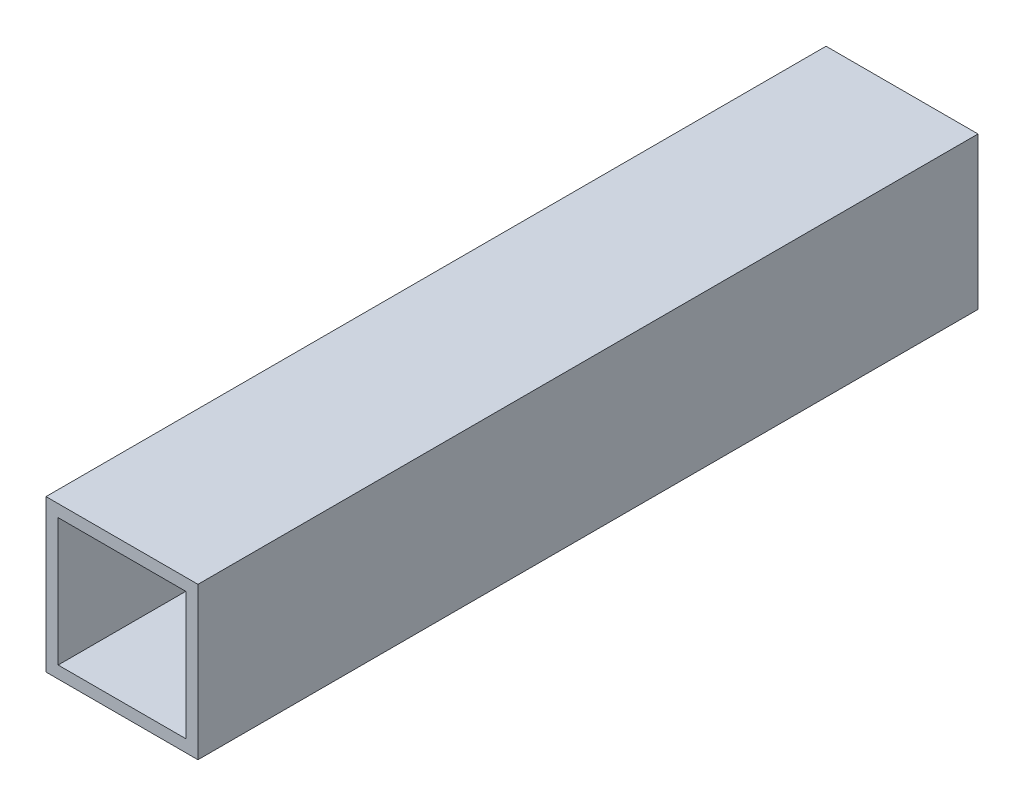
ISO-10303-21;
HEADER;
FILE_DESCRIPTION(('STEP AP214'),'2;1');
FILE_NAME('part.step','',(''),(''),'','','');
FILE_SCHEMA(('AUTOMOTIVE_DESIGN { 1 0 10303 214 1 1 1 1 }'));
ENDSEC;
DATA;
#1=APPLICATION_CONTEXT('core data for automotive mechanical design processes');
#2=APPLICATION_PROTOCOL_DEFINITION('international standard','automotive_design',2000,#1);
#3=PRODUCT_CONTEXT('',#1,'mechanical');
#4=PRODUCT('Part','Part','',(#3));
#5=PRODUCT_RELATED_PRODUCT_CATEGORY('part','',(#4));
#6=PRODUCT_DEFINITION_FORMATION('','',#4);
#7=PRODUCT_DEFINITION_CONTEXT('part definition',#1,'design');
#8=PRODUCT_DEFINITION('design','',#6,#7);
#9=PRODUCT_DEFINITION_SHAPE('','',#8);
#10=(LENGTH_UNIT() NAMED_UNIT(*) SI_UNIT(.MILLI.,.METRE.));
#11=(NAMED_UNIT(*) PLANE_ANGLE_UNIT() SI_UNIT($,.RADIAN.));
#12=(NAMED_UNIT(*) SI_UNIT($,.STERADIAN.) SOLID_ANGLE_UNIT());
#13=UNCERTAINTY_MEASURE_WITH_UNIT(LENGTH_MEASURE(1.E-05),#10,'distance_accuracy_value','');
#14=(GEOMETRIC_REPRESENTATION_CONTEXT(3) GLOBAL_UNCERTAINTY_ASSIGNED_CONTEXT((#13)) GLOBAL_UNIT_ASSIGNED_CONTEXT((#10,
#11,#12)) REPRESENTATION_CONTEXT('',''));
#15=CARTESIAN_POINT('',(0.,0.,0.));
#16=DIRECTION('',(0.,0.,1.));
#17=DIRECTION('',(1.,0.,0.));
#18=AXIS2_PLACEMENT_3D('',#15,#16,#17);
#19=CARTESIAN_POINT('',(0.,0.,77.));
#20=DIRECTION('',(0.,0.,-1.));
#21=DIRECTION('',(-1.,0.,0.));
#22=AXIS2_PLACEMENT_3D('',#19,#20,#21);
#23=PLANE('',#22);
#24=DIRECTION('',(0.,1.,0.));
#25=VECTOR('',#24,1.);
#26=CARTESIAN_POINT('',(7.5,-7.5,77.));
#27=LINE('',#26,#25);
#28=CARTESIAN_POINT('',(7.5,-7.5,77.));
#29=VERTEX_POINT('',#28);
#30=CARTESIAN_POINT('',(7.5,7.5,77.));
#31=VERTEX_POINT('',#30);
#32=EDGE_CURVE('E134',#29,#31,#27,.T.);
#33=ORIENTED_EDGE('',*,*,#32,.T.);
#34=DIRECTION('',(-1.,0.,0.));
#35=VECTOR('',#34,1.);
#36=CARTESIAN_POINT('',(-7.5,7.5,77.));
#37=LINE('',#36,#35);
#38=CARTESIAN_POINT('',(-7.5,7.5,77.));
#39=VERTEX_POINT('',#38);
#40=EDGE_CURVE('E137',#31,#39,#37,.T.);
#41=ORIENTED_EDGE('',*,*,#40,.T.);
#42=DIRECTION('',(0.,-1.,0.));
#43=VECTOR('',#42,1.);
#44=CARTESIAN_POINT('',(-7.5,-7.5,77.));
#45=LINE('',#44,#43);
#46=CARTESIAN_POINT('',(-7.5,-7.5,77.));
#47=VERTEX_POINT('',#46);
#48=EDGE_CURVE('E140',#39,#47,#45,.T.);
#49=ORIENTED_EDGE('',*,*,#48,.T.);
#50=DIRECTION('',(1.,0.,0.));
#51=VECTOR('',#50,1.);
#52=CARTESIAN_POINT('',(-7.5,-7.5,77.));
#53=LINE('',#52,#51);
#54=EDGE_CURVE('E142',#47,#29,#53,.T.);
#55=ORIENTED_EDGE('',*,*,#54,.T.);
#56=EDGE_LOOP('',(#33,#41,#49,#55));
#57=FACE_BOUND('',#56,.T.);
#58=DIRECTION('',(1.,0.,0.));
#59=VECTOR('',#58,1.);
#60=CARTESIAN_POINT('',(-6.3,-6.3,77.));
#61=LINE('',#60,#59);
#62=CARTESIAN_POINT('',(-6.3,-6.3,77.));
#63=VERTEX_POINT('',#62);
#64=CARTESIAN_POINT('',(6.3,-6.3,77.));
#65=VERTEX_POINT('',#64);
#66=EDGE_CURVE('E98',#63,#65,#61,.T.);
#67=ORIENTED_EDGE('',*,*,#66,.F.);
#68=DIRECTION('',(0.,-1.,0.));
#69=VECTOR('',#68,1.);
#70=CARTESIAN_POINT('',(-6.3,-6.3,77.));
#71=LINE('',#70,#69);
#72=CARTESIAN_POINT('',(-6.3,6.3,77.));
#73=VERTEX_POINT('',#72);
#74=EDGE_CURVE('E120',#73,#63,#71,.T.);
#75=ORIENTED_EDGE('',*,*,#74,.F.);
#76=DIRECTION('',(-1.,0.,0.));
#77=VECTOR('',#76,1.);
#78=CARTESIAN_POINT('',(-6.3,6.3,77.));
#79=LINE('',#78,#77);
#80=CARTESIAN_POINT('',(6.3,6.3,77.));
#81=VERTEX_POINT('',#80);
#82=EDGE_CURVE('E118',#81,#73,#79,.T.);
#83=ORIENTED_EDGE('',*,*,#82,.F.);
#84=DIRECTION('',(0.,1.,0.));
#85=VECTOR('',#84,1.);
#86=CARTESIAN_POINT('',(6.3,-6.3,77.));
#87=LINE('',#86,#85);
#88=EDGE_CURVE('E106',#65,#81,#87,.T.);
#89=ORIENTED_EDGE('',*,*,#88,.F.);
#90=EDGE_LOOP('',(#67,#75,#83,#89));
#91=FACE_BOUND('',#90,.T.);
#92=ADVANCED_FACE('F33',(#57,#91),#23,.F.);
#93=CARTESIAN_POINT('',(0.,0.,0.));
#94=DIRECTION('',(0.,0.,-1.));
#95=DIRECTION('',(-1.,0.,0.));
#96=AXIS2_PLACEMENT_3D('',#93,#94,#95);
#97=PLANE('',#96);
#98=DIRECTION('',(0.,1.,0.));
#99=VECTOR('',#98,1.);
#100=CARTESIAN_POINT('',(7.5,-7.5,0.));
#101=LINE('',#100,#99);
#102=CARTESIAN_POINT('',(7.5,-7.5,0.));
#103=VERTEX_POINT('',#102);
#104=CARTESIAN_POINT('',(7.5,7.5,0.));
#105=VERTEX_POINT('',#104);
#106=EDGE_CURVE('E114',#103,#105,#101,.T.);
#107=ORIENTED_EDGE('',*,*,#106,.F.);
#108=DIRECTION('',(1.,0.,0.));
#109=VECTOR('',#108,1.);
#110=CARTESIAN_POINT('',(-7.5,-7.5,0.));
#111=LINE('',#110,#109);
#112=CARTESIAN_POINT('',(-7.5,-7.5,0.));
#113=VERTEX_POINT('',#112);
#114=EDGE_CURVE('E138',#113,#103,#111,.T.);
#115=ORIENTED_EDGE('',*,*,#114,.F.);
#116=DIRECTION('',(0.,-1.,0.));
#117=VECTOR('',#116,1.);
#118=CARTESIAN_POINT('',(-7.5,-7.5,0.));
#119=LINE('',#118,#117);
#120=CARTESIAN_POINT('',(-7.5,7.5,0.));
#121=VERTEX_POINT('',#120);
#122=EDGE_CURVE('E149',#121,#113,#119,.T.);
#123=ORIENTED_EDGE('',*,*,#122,.F.);
#124=DIRECTION('',(-1.,0.,0.));
#125=VECTOR('',#124,1.);
#126=CARTESIAN_POINT('',(-7.5,7.5,0.));
#127=LINE('',#126,#125);
#128=EDGE_CURVE('E147',#105,#121,#127,.T.);
#129=ORIENTED_EDGE('',*,*,#128,.F.);
#130=EDGE_LOOP('',(#107,#115,#123,#129));
#131=FACE_BOUND('',#130,.T.);
#132=DIRECTION('',(0.,-1.,0.));
#133=VECTOR('',#132,1.);
#134=CARTESIAN_POINT('',(-6.3,-6.3,0.));
#135=LINE('',#134,#133);
#136=CARTESIAN_POINT('',(-6.3,6.3,0.));
#137=VERTEX_POINT('',#136);
#138=CARTESIAN_POINT('',(-6.3,-6.3,0.));
#139=VERTEX_POINT('',#138);
#140=EDGE_CURVE('E107',#137,#139,#135,.T.);
#141=ORIENTED_EDGE('',*,*,#140,.T.);
#142=DIRECTION('',(1.,0.,0.));
#143=VECTOR('',#142,1.);
#144=CARTESIAN_POINT('',(-6.3,-6.3,0.));
#145=LINE('',#144,#143);
#146=CARTESIAN_POINT('',(6.3,-6.3,0.));
#147=VERTEX_POINT('',#146);
#148=EDGE_CURVE('E56',#139,#147,#145,.T.);
#149=ORIENTED_EDGE('',*,*,#148,.T.);
#150=DIRECTION('',(0.,1.,0.));
#151=VECTOR('',#150,1.);
#152=CARTESIAN_POINT('',(6.3,-6.3,0.));
#153=LINE('',#152,#151);
#154=CARTESIAN_POINT('',(6.3,6.3,0.));
#155=VERTEX_POINT('',#154);
#156=EDGE_CURVE('E113',#147,#155,#153,.T.);
#157=ORIENTED_EDGE('',*,*,#156,.T.);
#158=DIRECTION('',(-1.,0.,0.));
#159=VECTOR('',#158,1.);
#160=CARTESIAN_POINT('',(-6.3,6.3,0.));
#161=LINE('',#160,#159);
#162=EDGE_CURVE('E126',#155,#137,#161,.T.);
#163=ORIENTED_EDGE('',*,*,#162,.T.);
#164=EDGE_LOOP('',(#141,#149,#157,#163));
#165=FACE_BOUND('',#164,.T.);
#166=ADVANCED_FACE('F167',(#131,#165),#97,.T.);
#167=CARTESIAN_POINT('',(7.5,-7.5,77.));
#168=DIRECTION('',(-1.,0.,0.));
#169=DIRECTION('',(0.,0.,1.));
#170=AXIS2_PLACEMENT_3D('',#167,#168,#169);
#171=PLANE('',#170);
#172=ORIENTED_EDGE('',*,*,#106,.T.);
#173=DIRECTION('',(0.,0.,-1.));
#174=VECTOR('',#173,1.);
#175=CARTESIAN_POINT('',(7.5,7.5,77.));
#176=LINE('',#175,#174);
#177=EDGE_CURVE('E11',#31,#105,#176,.T.);
#178=ORIENTED_EDGE('',*,*,#177,.F.);
#179=ORIENTED_EDGE('',*,*,#32,.F.);
#180=DIRECTION('',(0.,0.,-1.));
#181=VECTOR('',#180,1.);
#182=CARTESIAN_POINT('',(7.5,-7.5,77.));
#183=LINE('',#182,#181);
#184=EDGE_CURVE('E144',#29,#103,#183,.T.);
#185=ORIENTED_EDGE('',*,*,#184,.T.);
#186=EDGE_LOOP('',(#172,#178,#179,#185));
#187=FACE_BOUND('',#186,.T.);
#188=ADVANCED_FACE('F35',(#187),#171,.F.);
#189=CARTESIAN_POINT('',(-7.5,7.5,77.));
#190=DIRECTION('',(0.,-1.,0.));
#191=DIRECTION('',(0.,0.,-1.));
#192=AXIS2_PLACEMENT_3D('',#189,#190,#191);
#193=PLANE('',#192);
#194=ORIENTED_EDGE('',*,*,#128,.T.);
#195=DIRECTION('',(0.,0.,-1.));
#196=VECTOR('',#195,1.);
#197=CARTESIAN_POINT('',(-7.5,7.5,77.));
#198=LINE('',#197,#196);
#199=EDGE_CURVE('E41',#39,#121,#198,.T.);
#200=ORIENTED_EDGE('',*,*,#199,.F.);
#201=ORIENTED_EDGE('',*,*,#40,.F.);
#202=ORIENTED_EDGE('',*,*,#177,.T.);
#203=EDGE_LOOP('',(#194,#200,#201,#202));
#204=FACE_BOUND('',#203,.T.);
#205=ADVANCED_FACE('F177',(#204),#193,.F.);
#206=CARTESIAN_POINT('',(-7.5,-7.5,77.));
#207=DIRECTION('',(1.,0.,0.));
#208=DIRECTION('',(0.,0.,-1.));
#209=AXIS2_PLACEMENT_3D('',#206,#207,#208);
#210=PLANE('',#209);
#211=ORIENTED_EDGE('',*,*,#122,.T.);
#212=DIRECTION('',(0.,0.,-1.));
#213=VECTOR('',#212,1.);
#214=CARTESIAN_POINT('',(-7.5,-7.5,77.));
#215=LINE('',#214,#213);
#216=EDGE_CURVE('E154',#47,#113,#215,.T.);
#217=ORIENTED_EDGE('',*,*,#216,.F.);
#218=ORIENTED_EDGE('',*,*,#48,.F.);
#219=ORIENTED_EDGE('',*,*,#199,.T.);
#220=EDGE_LOOP('',(#211,#217,#218,#219));
#221=FACE_BOUND('',#220,.T.);
#222=ADVANCED_FACE('F161',(#221),#210,.F.);
#223=CARTESIAN_POINT('',(-7.5,-7.5,77.));
#224=DIRECTION('',(0.,1.,0.));
#225=DIRECTION('',(0.,0.,1.));
#226=AXIS2_PLACEMENT_3D('',#223,#224,#225);
#227=PLANE('',#226);
#228=ORIENTED_EDGE('',*,*,#114,.T.);
#229=ORIENTED_EDGE('',*,*,#184,.F.);
#230=ORIENTED_EDGE('',*,*,#54,.F.);
#231=ORIENTED_EDGE('',*,*,#216,.T.);
#232=EDGE_LOOP('',(#228,#229,#230,#231));
#233=FACE_BOUND('',#232,.T.);
#234=ADVANCED_FACE('F171',(#233),#227,.F.);
#235=CARTESIAN_POINT('',(-6.3,-6.3,77.));
#236=DIRECTION('',(0.,1.,0.));
#237=DIRECTION('',(0.,0.,1.));
#238=AXIS2_PLACEMENT_3D('',#235,#236,#237);
#239=PLANE('',#238);
#240=ORIENTED_EDGE('',*,*,#148,.F.);
#241=DIRECTION('',(0.,0.,-1.));
#242=VECTOR('',#241,1.);
#243=CARTESIAN_POINT('',(-6.3,-6.3,77.));
#244=LINE('',#243,#242);
#245=EDGE_CURVE('E102',#63,#139,#244,.T.);
#246=ORIENTED_EDGE('',*,*,#245,.F.);
#247=ORIENTED_EDGE('',*,*,#66,.T.);
#248=DIRECTION('',(0.,0.,-1.));
#249=VECTOR('',#248,1.);
#250=CARTESIAN_POINT('',(6.3,-6.3,77.));
#251=LINE('',#250,#249);
#252=EDGE_CURVE('E101',#65,#147,#251,.T.);
#253=ORIENTED_EDGE('',*,*,#252,.T.);
#254=EDGE_LOOP('',(#240,#246,#247,#253));
#255=FACE_BOUND('',#254,.T.);
#256=ADVANCED_FACE('F100',(#255),#239,.T.);
#257=CARTESIAN_POINT('',(6.3,-6.3,77.));
#258=DIRECTION('',(-1.,0.,0.));
#259=DIRECTION('',(0.,0.,1.));
#260=AXIS2_PLACEMENT_3D('',#257,#258,#259);
#261=PLANE('',#260);
#262=ORIENTED_EDGE('',*,*,#156,.F.);
#263=ORIENTED_EDGE('',*,*,#252,.F.);
#264=ORIENTED_EDGE('',*,*,#88,.T.);
#265=DIRECTION('',(0.,0.,-1.));
#266=VECTOR('',#265,1.);
#267=CARTESIAN_POINT('',(6.3,6.3,77.));
#268=LINE('',#267,#266);
#269=EDGE_CURVE('E115',#81,#155,#268,.T.);
#270=ORIENTED_EDGE('',*,*,#269,.T.);
#271=EDGE_LOOP('',(#262,#263,#264,#270));
#272=FACE_BOUND('',#271,.T.);
#273=ADVANCED_FACE('F110',(#272),#261,.T.);
#274=CARTESIAN_POINT('',(-6.3,6.3,77.));
#275=DIRECTION('',(0.,-1.,0.));
#276=DIRECTION('',(0.,0.,-1.));
#277=AXIS2_PLACEMENT_3D('',#274,#275,#276);
#278=PLANE('',#277);
#279=ORIENTED_EDGE('',*,*,#162,.F.);
#280=ORIENTED_EDGE('',*,*,#269,.F.);
#281=ORIENTED_EDGE('',*,*,#82,.T.);
#282=DIRECTION('',(0.,0.,-1.));
#283=VECTOR('',#282,1.);
#284=CARTESIAN_POINT('',(-6.3,6.3,77.));
#285=LINE('',#284,#283);
#286=EDGE_CURVE('E48',#73,#137,#285,.T.);
#287=ORIENTED_EDGE('',*,*,#286,.T.);
#288=EDGE_LOOP('',(#279,#280,#281,#287));
#289=FACE_BOUND('',#288,.T.);
#290=ADVANCED_FACE('F200',(#289),#278,.T.);
#291=CARTESIAN_POINT('',(-6.3,-6.3,77.));
#292=DIRECTION('',(1.,0.,0.));
#293=DIRECTION('',(0.,0.,-1.));
#294=AXIS2_PLACEMENT_3D('',#291,#292,#293);
#295=PLANE('',#294);
#296=ORIENTED_EDGE('',*,*,#140,.F.);
#297=ORIENTED_EDGE('',*,*,#286,.F.);
#298=ORIENTED_EDGE('',*,*,#74,.T.);
#299=ORIENTED_EDGE('',*,*,#245,.T.);
#300=EDGE_LOOP('',(#296,#297,#298,#299));
#301=FACE_BOUND('',#300,.T.);
#302=ADVANCED_FACE('F204',(#301),#295,.T.);
#303=CLOSED_SHELL('',(#92,#166,#188,#205,#222,#234,#256,#273,#290,#302));
#304=MANIFOLD_SOLID_BREP('B2',#303);
#305=ADVANCED_BREP_SHAPE_REPRESENTATION('',(#18,#304),#14);
#306=SHAPE_DEFINITION_REPRESENTATION(#9,#305);
ENDSEC;
END-ISO-10303-21;
